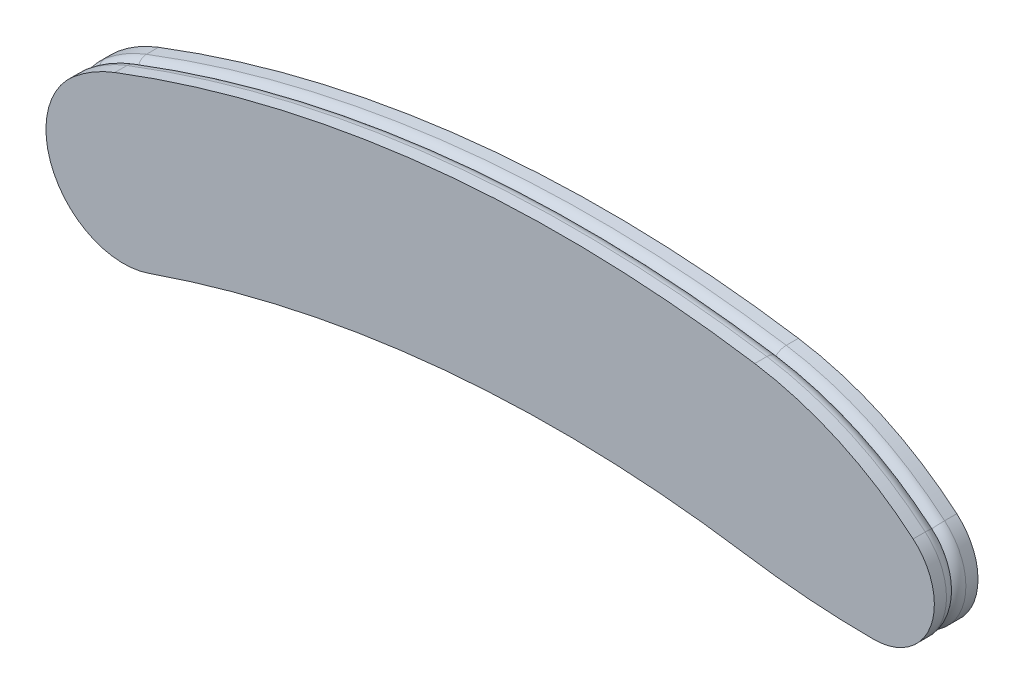
ISO-10303-21;
HEADER;
FILE_DESCRIPTION(('STEP AP214'),'2;1');
FILE_NAME('part.step','',(''),(''),'','','');
FILE_SCHEMA(('AUTOMOTIVE_DESIGN { 1 0 10303 214 1 1 1 1 }'));
ENDSEC;
DATA;
#1=APPLICATION_CONTEXT('core data for automotive mechanical design processes');
#2=APPLICATION_PROTOCOL_DEFINITION('international standard','automotive_design',2000,#1);
#3=PRODUCT_CONTEXT('',#1,'mechanical');
#4=PRODUCT('Part','Part','',(#3));
#5=PRODUCT_RELATED_PRODUCT_CATEGORY('part','',(#4));
#6=PRODUCT_DEFINITION_FORMATION('','',#4);
#7=PRODUCT_DEFINITION_CONTEXT('part definition',#1,'design');
#8=PRODUCT_DEFINITION('design','',#6,#7);
#9=PRODUCT_DEFINITION_SHAPE('','',#8);
#10=(LENGTH_UNIT() NAMED_UNIT(*) SI_UNIT(.MILLI.,.METRE.));
#11=(NAMED_UNIT(*) PLANE_ANGLE_UNIT() SI_UNIT($,.RADIAN.));
#12=(NAMED_UNIT(*) SI_UNIT($,.STERADIAN.) SOLID_ANGLE_UNIT());
#13=UNCERTAINTY_MEASURE_WITH_UNIT(LENGTH_MEASURE(1.E-05),#10,'distance_accuracy_value','');
#14=(GEOMETRIC_REPRESENTATION_CONTEXT(3) GLOBAL_UNCERTAINTY_ASSIGNED_CONTEXT((#13)) GLOBAL_UNIT_ASSIGNED_CONTEXT((#10,
#11,#12)) REPRESENTATION_CONTEXT('',''));
#15=CARTESIAN_POINT('',(0.,0.,0.));
#16=DIRECTION('',(0.,0.,1.));
#17=DIRECTION('',(1.,0.,0.));
#18=AXIS2_PLACEMENT_3D('',#15,#16,#17);
#19=CARTESIAN_POINT('',(-74.7215728623867,1.04234452640998,2.286));
#20=DIRECTION('',(0.,0.,-1.));
#21=DIRECTION('',(1.,0.,0.));
#22=AXIS2_PLACEMENT_3D('',#19,#20,#21);
#23=CYLINDRICAL_SURFACE('',#22,33.3863887810395);
#24=DIRECTION('',(0.,0.,-1.));
#25=VECTOR('',#24,1.);
#26=CARTESIAN_POINT('',(-69.6157277483273,34.036,2.286));
#27=LINE('',#26,#25);
#28=CARTESIAN_POINT('',(-69.6157277483273,34.036,2.286));
#29=VERTEX_POINT('',#28);
#30=CARTESIAN_POINT('',(-69.6157277483273,34.036,1.016));
#31=VERTEX_POINT('',#30);
#32=EDGE_CURVE('E157',#29,#31,#27,.T.);
#33=ORIENTED_EDGE('',*,*,#32,.F.);
#34=CARTESIAN_POINT('',(-74.7215728623867,1.04234452640998,2.286));
#35=DIRECTION('',(0.,0.,-1.));
#36=DIRECTION('',(-1.,0.,0.));
#37=AXIS2_PLACEMENT_3D('',#34,#35,#36);
#38=CIRCLE('',#37,33.3863887810395);
#39=CARTESIAN_POINT('',(-53.0229884904449,26.416,2.286));
#40=VERTEX_POINT('',#39);
#41=EDGE_CURVE('E136',#29,#40,#38,.T.);
#42=ORIENTED_EDGE('',*,*,#41,.T.);
#43=DIRECTION('',(0.,0.,-1.));
#44=VECTOR('',#43,1.);
#45=CARTESIAN_POINT('',(-53.0229884904449,26.416,2.286));
#46=LINE('',#45,#44);
#47=CARTESIAN_POINT('',(-53.0229884904449,26.416,1.016));
#48=VERTEX_POINT('',#47);
#49=EDGE_CURVE('E146',#40,#48,#46,.T.);
#50=ORIENTED_EDGE('',*,*,#49,.T.);
#51=CARTESIAN_POINT('',(-74.7215728623867,1.04234452640998,1.016));
#52=DIRECTION('',(0.,0.,-1.));
#53=DIRECTION('',(-1.,0.,0.));
#54=AXIS2_PLACEMENT_3D('',#51,#52,#53);
#55=CIRCLE('',#54,33.3863887810395);
#56=EDGE_CURVE('E209',#31,#48,#55,.T.);
#57=ORIENTED_EDGE('',*,*,#56,.F.);
#58=EDGE_LOOP('',(#33,#42,#50,#57));
#59=FACE_BOUND('',#58,.T.);
#60=ADVANCED_FACE('F48',(#59),#23,.T.);
#61=CARTESIAN_POINT('',(-57.15,21.59,2.286));
#62=DIRECTION('',(0.,0.,-1.));
#63=DIRECTION('',(1.,0.,0.));
#64=AXIS2_PLACEMENT_3D('',#61,#62,#63);
#65=CYLINDRICAL_SURFACE('',#64,6.35);
#66=ORIENTED_EDGE('',*,*,#49,.F.);
#67=CARTESIAN_POINT('',(-57.15,21.59,2.286));
#68=DIRECTION('',(0.,0.,-1.));
#69=DIRECTION('',(-1.,0.,0.));
#70=AXIS2_PLACEMENT_3D('',#67,#68,#69);
#71=CIRCLE('',#70,6.35);
#72=CARTESIAN_POINT('',(-57.15,15.24,2.286));
#73=VERTEX_POINT('',#72);
#74=EDGE_CURVE('E132',#40,#73,#71,.T.);
#75=ORIENTED_EDGE('',*,*,#74,.T.);
#76=DIRECTION('',(0.,0.,-1.));
#77=VECTOR('',#76,1.);
#78=CARTESIAN_POINT('',(-57.15,15.24,2.286));
#79=LINE('',#78,#77);
#80=CARTESIAN_POINT('',(-57.15,15.24,1.016));
#81=VERTEX_POINT('',#80);
#82=EDGE_CURVE('E154',#73,#81,#79,.T.);
#83=ORIENTED_EDGE('',*,*,#82,.T.);
#84=CARTESIAN_POINT('',(-57.15,21.59,1.016));
#85=DIRECTION('',(0.,0.,-1.));
#86=DIRECTION('',(-1.,0.,0.));
#87=AXIS2_PLACEMENT_3D('',#84,#85,#86);
#88=CIRCLE('',#87,6.35);
#89=EDGE_CURVE('E149',#48,#81,#88,.T.);
#90=ORIENTED_EDGE('',*,*,#89,.F.);
#91=EDGE_LOOP('',(#66,#75,#83,#90));
#92=FACE_BOUND('',#91,.T.);
#93=ADVANCED_FACE('F147',(#92),#65,.T.);
#94=CARTESIAN_POINT('',(-57.15,104.93375,2.286));
#95=DIRECTION('',(0.,0.,-1.));
#96=DIRECTION('',(1.,0.,0.));
#97=AXIS2_PLACEMENT_3D('',#94,#95,#96);
#98=CYLINDRICAL_SURFACE('',#97,89.6937500000003);
#99=ORIENTED_EDGE('',*,*,#82,.F.);
#100=CARTESIAN_POINT('',(-57.15,104.93375,2.286));
#101=DIRECTION('',(0.,0.,-1.));
#102=DIRECTION('',(-1.,0.,0.));
#103=AXIS2_PLACEMENT_3D('',#100,#101,#102);
#104=CIRCLE('',#103,89.6937500000003);
#105=CARTESIAN_POINT('',(-70.6119999999999,16.256,2.286));
#106=VERTEX_POINT('',#105);
#107=EDGE_CURVE('E139',#73,#106,#104,.T.);
#108=ORIENTED_EDGE('',*,*,#107,.T.);
#109=DIRECTION('',(0.,0.,-1.));
#110=VECTOR('',#109,1.);
#111=CARTESIAN_POINT('',(-70.6119999999999,16.256,2.286));
#112=LINE('',#111,#110);
#113=CARTESIAN_POINT('',(-70.6119999999999,16.256,1.016));
#114=VERTEX_POINT('',#113);
#115=EDGE_CURVE('E183',#106,#114,#112,.T.);
#116=ORIENTED_EDGE('',*,*,#115,.T.);
#117=CARTESIAN_POINT('',(-57.15,104.93375,1.016));
#118=DIRECTION('',(0.,0.,-1.));
#119=DIRECTION('',(-1.,0.,0.));
#120=AXIS2_PLACEMENT_3D('',#117,#118,#119);
#121=CIRCLE('',#120,89.6937500000003);
#122=EDGE_CURVE('E153',#81,#114,#121,.T.);
#123=ORIENTED_EDGE('',*,*,#122,.F.);
#124=EDGE_LOOP('',(#99,#108,#116,#123));
#125=FACE_BOUND('',#124,.T.);
#126=ADVANCED_FACE('F252',(#125),#98,.T.);
#127=CARTESIAN_POINT('',(-90.1893374241713,-112.705092985167,2.286));
#128=DIRECTION('',(0.,0.,-1.));
#129=DIRECTION('',(1.,0.,0.));
#130=AXIS2_PLACEMENT_3D('',#127,#128,#129);
#131=CYLINDRICAL_SURFACE('',#130,130.438627885105);
#132=ORIENTED_EDGE('',*,*,#115,.F.);
#133=CARTESIAN_POINT('',(-90.1893374241713,-112.705092985167,2.286));
#134=DIRECTION('',(0.,0.,1.));
#135=DIRECTION('',(-1.,0.,0.));
#136=AXIS2_PLACEMENT_3D('',#133,#134,#135);
#137=CIRCLE('',#136,130.438627885105);
#138=CARTESIAN_POINT('',(-133.070926792478,10.4834005432333,2.286));
#139=VERTEX_POINT('',#138);
#140=EDGE_CURVE('E162',#106,#139,#137,.T.);
#141=ORIENTED_EDGE('',*,*,#140,.T.);
#142=DIRECTION('',(0.,0.,-1.));
#143=VECTOR('',#142,1.);
#144=CARTESIAN_POINT('',(-133.070926792478,10.4834005432333,2.286));
#145=LINE('',#144,#143);
#146=CARTESIAN_POINT('',(-133.070926792478,10.4834005432333,1.016));
#147=VERTEX_POINT('',#146);
#148=EDGE_CURVE('E180',#139,#147,#145,.T.);
#149=ORIENTED_EDGE('',*,*,#148,.T.);
#150=CARTESIAN_POINT('',(-90.1893374241713,-112.705092985167,1.016));
#151=DIRECTION('',(0.,0.,-1.));
#152=DIRECTION('',(-1.,0.,0.));
#153=AXIS2_PLACEMENT_3D('',#150,#151,#152);
#154=CIRCLE('',#153,130.438627885105);
#155=EDGE_CURVE('E12',#114,#147,#154,.F.);
#156=ORIENTED_EDGE('',*,*,#155,.F.);
#157=EDGE_LOOP('',(#132,#141,#149,#156));
#158=FACE_BOUND('',#157,.T.);
#159=ADVANCED_FACE('F249',(#158),#131,.F.);
#160=CARTESIAN_POINT('',(-135.742999966174,18.159624156079,2.286));
#161=DIRECTION('',(0.,0.,-1.));
#162=DIRECTION('',(1.,0.,0.));
#163=AXIS2_PLACEMENT_3D('',#160,#161,#162);
#164=CYLINDRICAL_SURFACE('',#163,8.128);
#165=ORIENTED_EDGE('',*,*,#148,.F.);
#166=CARTESIAN_POINT('',(-135.742999966174,18.159624156079,2.286));
#167=DIRECTION('',(0.,0.,-1.));
#168=DIRECTION('',(-1.,0.,0.));
#169=AXIS2_PLACEMENT_3D('',#166,#167,#168);
#170=CIRCLE('',#169,8.128);
#171=CARTESIAN_POINT('',(-140.97,24.384,2.286));
#172=VERTEX_POINT('',#171);
#173=EDGE_CURVE('E165',#139,#172,#170,.T.);
#174=ORIENTED_EDGE('',*,*,#173,.T.);
#175=DIRECTION('',(0.,0.,-1.));
#176=VECTOR('',#175,1.);
#177=CARTESIAN_POINT('',(-140.97,24.384,2.286));
#178=LINE('',#177,#176);
#179=CARTESIAN_POINT('',(-140.97,24.384,1.016));
#180=VERTEX_POINT('',#179);
#181=EDGE_CURVE('E177',#172,#180,#178,.T.);
#182=ORIENTED_EDGE('',*,*,#181,.T.);
#183=CARTESIAN_POINT('',(-135.742999966174,18.159624156079,1.016));
#184=DIRECTION('',(0.,0.,-1.));
#185=DIRECTION('',(-1.,0.,0.));
#186=AXIS2_PLACEMENT_3D('',#183,#184,#185);
#187=CIRCLE('',#186,8.128);
#188=EDGE_CURVE('E57',#147,#180,#187,.T.);
#189=ORIENTED_EDGE('',*,*,#188,.F.);
#190=EDGE_LOOP('',(#165,#174,#182,#189));
#191=FACE_BOUND('',#190,.T.);
#192=ADVANCED_FACE('F245',(#191),#164,.T.);
#193=CARTESIAN_POINT('',(-131.267684261023,12.8303632437396,2.286));
#194=DIRECTION('',(0.,0.,-1.));
#195=DIRECTION('',(1.,0.,0.));
#196=AXIS2_PLACEMENT_3D('',#193,#194,#195);
#197=CYLINDRICAL_SURFACE('',#196,15.0871287193557);
#198=ORIENTED_EDGE('',*,*,#181,.F.);
#199=CARTESIAN_POINT('',(-131.267684261023,12.8303632437396,2.286));
#200=DIRECTION('',(0.,0.,-1.));
#201=DIRECTION('',(-1.,0.,0.));
#202=AXIS2_PLACEMENT_3D('',#199,#200,#201);
#203=CIRCLE('',#202,15.0871287193557);
#204=CARTESIAN_POINT('',(-136.652,26.924,2.286));
#205=VERTEX_POINT('',#204);
#206=EDGE_CURVE('E168',#172,#205,#203,.T.);
#207=ORIENTED_EDGE('',*,*,#206,.T.);
#208=DIRECTION('',(0.,0.,-1.));
#209=VECTOR('',#208,1.);
#210=CARTESIAN_POINT('',(-136.652,26.924,2.286));
#211=LINE('',#210,#209);
#212=CARTESIAN_POINT('',(-136.652,26.924,1.016));
#213=VERTEX_POINT('',#212);
#214=EDGE_CURVE('E174',#205,#213,#211,.T.);
#215=ORIENTED_EDGE('',*,*,#214,.T.);
#216=CARTESIAN_POINT('',(-131.267684261023,12.8303632437396,1.016));
#217=DIRECTION('',(0.,0.,-1.));
#218=DIRECTION('',(-1.,0.,0.));
#219=AXIS2_PLACEMENT_3D('',#216,#217,#218);
#220=CIRCLE('',#219,15.0871287193557);
#221=EDGE_CURVE('E214',#180,#213,#220,.T.);
#222=ORIENTED_EDGE('',*,*,#221,.F.);
#223=EDGE_LOOP('',(#198,#207,#215,#222));
#224=FACE_BOUND('',#223,.T.);
#225=ADVANCED_FACE('F243',(#224),#197,.T.);
#226=CARTESIAN_POINT('',(-89.7250228038504,-95.909021452324,2.286));
#227=DIRECTION('',(0.,0.,-1.));
#228=DIRECTION('',(1.,0.,0.));
#229=AXIS2_PLACEMENT_3D('',#226,#227,#228);
#230=CYLINDRICAL_SURFACE('',#229,131.491795743594);
#231=ORIENTED_EDGE('',*,*,#214,.F.);
#232=CARTESIAN_POINT('',(-89.7250228038504,-95.909021452324,2.286));
#233=DIRECTION('',(0.,0.,-1.));
#234=DIRECTION('',(-1.,0.,0.));
#235=AXIS2_PLACEMENT_3D('',#232,#233,#234);
#236=CIRCLE('',#235,131.491795743594);
#237=EDGE_CURVE('E171',#205,#29,#236,.T.);
#238=ORIENTED_EDGE('',*,*,#237,.T.);
#239=ORIENTED_EDGE('',*,*,#32,.T.);
#240=CARTESIAN_POINT('',(-89.7250228038504,-95.909021452324,1.016));
#241=DIRECTION('',(0.,0.,-1.));
#242=DIRECTION('',(-1.,0.,0.));
#243=AXIS2_PLACEMENT_3D('',#240,#241,#242);
#244=CIRCLE('',#243,131.491795743594);
#245=EDGE_CURVE('E211',#213,#31,#244,.T.);
#246=ORIENTED_EDGE('',*,*,#245,.F.);
#247=EDGE_LOOP('',(#231,#238,#239,#246));
#248=FACE_BOUND('',#247,.T.);
#249=ADVANCED_FACE('F239',(#248),#230,.T.);
#250=CARTESIAN_POINT('',(-65.9357864311934,11.316172263205,2.286));
#251=DIRECTION('',(0.,0.,1.));
#252=DIRECTION('',(-1.,0.,0.));
#253=AXIS2_PLACEMENT_3D('',#250,#251,#252);
#254=PLANE('',#253);
#255=ORIENTED_EDGE('',*,*,#41,.F.);
#256=ORIENTED_EDGE('',*,*,#237,.F.);
#257=ORIENTED_EDGE('',*,*,#206,.F.);
#258=ORIENTED_EDGE('',*,*,#173,.F.);
#259=ORIENTED_EDGE('',*,*,#140,.F.);
#260=ORIENTED_EDGE('',*,*,#107,.F.);
#261=ORIENTED_EDGE('',*,*,#74,.F.);
#262=EDGE_LOOP('',(#255,#256,#257,#258,#259,#260,#261));
#263=FACE_BOUND('',#262,.T.);
#264=ADVANCED_FACE('F134',(#263),#254,.T.);
#265=CARTESIAN_POINT('',(-65.9357864311934,11.316172263205,-0.254));
#266=DIRECTION('',(0.,0.,1.));
#267=DIRECTION('',(-1.,0.,0.));
#268=AXIS2_PLACEMENT_3D('',#265,#266,#267);
#269=PLANE('',#268);
#270=CARTESIAN_POINT('',(-90.1893374241713,-112.705092985167,-0.254));
#271=DIRECTION('',(0.,0.,-1.));
#272=DIRECTION('',(-1.,0.,0.));
#273=AXIS2_PLACEMENT_3D('',#270,#271,#272);
#274=CIRCLE('',#273,131.708627885105);
#275=CARTESIAN_POINT('',(-133.488438225868,11.6828104827404,-0.254));
#276=VERTEX_POINT('',#275);
#277=CARTESIAN_POINT('',(-70.4213876106194,17.511614159292,-0.254));
#278=VERTEX_POINT('',#277);
#279=EDGE_CURVE('E189',#276,#278,#274,.T.);
#280=ORIENTED_EDGE('',*,*,#279,.F.);
#281=CARTESIAN_POINT('',(-135.742999966174,18.159624156079,-0.254));
#282=DIRECTION('',(0.,0.,-1.));
#283=DIRECTION('',(-1.,0.,0.));
#284=AXIS2_PLACEMENT_3D('',#281,#282,#283);
#285=CIRCLE('',#284,6.858);
#286=CARTESIAN_POINT('',(-140.153281244715,23.4114412743873,-0.254));
#287=VERTEX_POINT('',#286);
#288=EDGE_CURVE('E192',#287,#276,#285,.F.);
#289=ORIENTED_EDGE('',*,*,#288,.F.);
#290=CARTESIAN_POINT('',(-131.267684261023,12.8303632437396,-0.254));
#291=DIRECTION('',(0.,0.,-1.));
#292=DIRECTION('',(-1.,0.,0.));
#293=AXIS2_PLACEMENT_3D('',#290,#291,#292);
#294=CIRCLE('',#293,13.8171287193557);
#295=CARTESIAN_POINT('',(-136.19876061193,25.7376298819081,-0.254));
#296=VERTEX_POINT('',#295);
#297=EDGE_CURVE('E194',#296,#287,#294,.F.);
#298=ORIENTED_EDGE('',*,*,#297,.F.);
#299=CARTESIAN_POINT('',(-89.7250228038504,-95.909021452324,-0.254));
#300=DIRECTION('',(0.,0.,-1.));
#301=DIRECTION('',(-1.,0.,0.));
#302=AXIS2_PLACEMENT_3D('',#299,#300,#301);
#303=CIRCLE('',#302,130.221795743594);
#304=CARTESIAN_POINT('',(-69.8099513086346,32.7809393605799,-0.254));
#305=VERTEX_POINT('',#304);
#306=EDGE_CURVE('E196',#305,#296,#303,.F.);
#307=ORIENTED_EDGE('',*,*,#306,.F.);
#308=CARTESIAN_POINT('',(-74.7215728623867,1.04234452640998,-0.254));
#309=DIRECTION('',(0.,0.,-1.));
#310=DIRECTION('',(-1.,0.,0.));
#311=AXIS2_PLACEMENT_3D('',#308,#309,#310);
#312=CIRCLE('',#311,32.1163887810395);
#313=CARTESIAN_POINT('',(-53.8483907923559,25.4508,-0.254));
#314=VERTEX_POINT('',#313);
#315=EDGE_CURVE('E199',#314,#305,#312,.F.);
#316=ORIENTED_EDGE('',*,*,#315,.F.);
#317=CARTESIAN_POINT('',(-57.15,21.59,-0.254));
#318=DIRECTION('',(0.,0.,-1.));
#319=DIRECTION('',(-1.,0.,0.));
#320=AXIS2_PLACEMENT_3D('',#317,#318,#319);
#321=CIRCLE('',#320,5.08);
#322=CARTESIAN_POINT('',(-57.15,16.51,-0.254));
#323=VERTEX_POINT('',#322);
#324=EDGE_CURVE('E202',#323,#314,#321,.F.);
#325=ORIENTED_EDGE('',*,*,#324,.F.);
#326=CARTESIAN_POINT('',(-57.15,104.93375,-0.254));
#327=DIRECTION('',(0.,0.,-1.));
#328=DIRECTION('',(-1.,0.,0.));
#329=AXIS2_PLACEMENT_3D('',#326,#327,#328);
#330=CIRCLE('',#329,88.4237500000003);
#331=EDGE_CURVE('E205',#278,#323,#330,.F.);
#332=ORIENTED_EDGE('',*,*,#331,.F.);
#333=EDGE_LOOP('',(#280,#289,#298,#307,#316,#325,#332));
#334=FACE_BOUND('',#333,.T.);
#335=ADVANCED_FACE('F234',(#334),#269,.F.);
#336=CARTESIAN_POINT('',(-89.7250228038504,-95.909021452324,1.016));
#337=DIRECTION('',(0.,0.,1.));
#338=DIRECTION('',(-1.,0.,0.));
#339=AXIS2_PLACEMENT_3D('',#336,#337,#338);
#340=TOROIDAL_SURFACE('',#339,130.221795743594,1.27);
#341=CARTESIAN_POINT('',(-69.8099513086346,32.7809393605799,1.016));
#342=DIRECTION('',(-0.98823672395283,0.152931937249805,0.));
#343=DIRECTION('',(0.152931937249805,0.98823672395283,0.));
#344=AXIS2_PLACEMENT_3D('',#341,#342,#343);
#345=CIRCLE('',#344,1.27);
#346=EDGE_CURVE('E159',#31,#305,#345,.T.);
#347=ORIENTED_EDGE('',*,*,#346,.T.);
#348=ORIENTED_EDGE('',*,*,#306,.T.);
#349=CARTESIAN_POINT('',(-136.19876061193,25.7376298819081,1.016));
#350=DIRECTION('',(0.934149699285011,0.356881407929475,0.));
#351=DIRECTION('',(0.356881407929475,-0.934149699285011,0.));
#352=AXIS2_PLACEMENT_3D('',#349,#350,#351);
#353=CIRCLE('',#352,1.27);
#354=EDGE_CURVE('E52',#296,#213,#353,.T.);
#355=ORIENTED_EDGE('',*,*,#354,.T.);
#356=ORIENTED_EDGE('',*,*,#245,.T.);
#357=EDGE_LOOP('',(#347,#348,#355,#356));
#358=FACE_BOUND('',#357,.T.);
#359=ADVANCED_FACE('F50',(#358),#340,.T.);
#360=CARTESIAN_POINT('',(-131.267684261023,12.8303632437396,1.016));
#361=DIRECTION('',(0.,0.,1.));
#362=DIRECTION('',(-1.,0.,0.));
#363=AXIS2_PLACEMENT_3D('',#360,#361,#362);
#364=TOROIDAL_SURFACE('',#363,13.8171287193557,1.27);
#365=ORIENTED_EDGE('',*,*,#354,.F.);
#366=ORIENTED_EDGE('',*,*,#297,.T.);
#367=CARTESIAN_POINT('',(-140.153281244715,23.4114412743873,1.016));
#368=DIRECTION('',(0.765794272135951,0.643085634082872,0.));
#369=DIRECTION('',(0.643085634082872,-0.765794272135951,0.));
#370=AXIS2_PLACEMENT_3D('',#367,#368,#369);
#371=CIRCLE('',#370,1.27);
#372=EDGE_CURVE('E73',#287,#180,#371,.T.);
#373=ORIENTED_EDGE('',*,*,#372,.T.);
#374=ORIENTED_EDGE('',*,*,#221,.T.);
#375=EDGE_LOOP('',(#365,#366,#373,#374));
#376=FACE_BOUND('',#375,.T.);
#377=ADVANCED_FACE('F236',(#376),#364,.T.);
#378=CARTESIAN_POINT('',(-74.7215728623867,1.04234452640998,1.016));
#379=DIRECTION('',(0.,0.,1.));
#380=DIRECTION('',(-1.,0.,0.));
#381=AXIS2_PLACEMENT_3D('',#378,#379,#380);
#382=TOROIDAL_SURFACE('',#381,32.1163887810395,1.27);
#383=ORIENTED_EDGE('',*,*,#346,.F.);
#384=ORIENTED_EDGE('',*,*,#56,.T.);
#385=CARTESIAN_POINT('',(-53.8483907923559,25.4508,1.016));
#386=DIRECTION('',(-0.76,0.649923072370877,0.));
#387=DIRECTION('',(0.649923072370877,0.76,0.));
#388=AXIS2_PLACEMENT_3D('',#385,#386,#387);
#389=CIRCLE('',#388,1.27);
#390=EDGE_CURVE('E222',#48,#314,#389,.T.);
#391=ORIENTED_EDGE('',*,*,#390,.T.);
#392=ORIENTED_EDGE('',*,*,#315,.T.);
#393=EDGE_LOOP('',(#383,#384,#391,#392));
#394=FACE_BOUND('',#393,.T.);
#395=ADVANCED_FACE('F230',(#394),#382,.T.);
#396=CARTESIAN_POINT('',(-135.742999966174,18.159624156079,1.016));
#397=DIRECTION('',(0.,0.,1.));
#398=DIRECTION('',(-1.,0.,0.));
#399=AXIS2_PLACEMENT_3D('',#396,#397,#398);
#400=TOROIDAL_SURFACE('',#399,6.858,1.27);
#401=ORIENTED_EDGE('',*,*,#372,.F.);
#402=ORIENTED_EDGE('',*,*,#288,.T.);
#403=CARTESIAN_POINT('',(-133.488438225868,11.6828104827404,1.016));
#404=DIRECTION('',(-0.944417275202477,-0.328749160149694,0.));
#405=DIRECTION('',(-0.328749160149694,0.944417275202477,0.));
#406=AXIS2_PLACEMENT_3D('',#403,#404,#405);
#407=CIRCLE('',#406,1.27);
#408=EDGE_CURVE('E65',#276,#147,#407,.T.);
#409=ORIENTED_EDGE('',*,*,#408,.T.);
#410=ORIENTED_EDGE('',*,*,#188,.T.);
#411=EDGE_LOOP('',(#401,#402,#409,#410));
#412=FACE_BOUND('',#411,.T.);
#413=ADVANCED_FACE('F259',(#412),#400,.T.);
#414=CARTESIAN_POINT('',(-57.15,21.59,1.016));
#415=DIRECTION('',(0.,0.,1.));
#416=DIRECTION('',(-1.,0.,0.));
#417=AXIS2_PLACEMENT_3D('',#414,#415,#416);
#418=TOROIDAL_SURFACE('',#417,5.08,1.27);
#419=ORIENTED_EDGE('',*,*,#390,.F.);
#420=ORIENTED_EDGE('',*,*,#89,.T.);
#421=CARTESIAN_POINT('',(-57.15,16.51,1.016));
#422=DIRECTION('',(1.,0.,0.));
#423=DIRECTION('',(0.,-1.,0.));
#424=AXIS2_PLACEMENT_3D('',#421,#422,#423);
#425=CIRCLE('',#424,1.27);
#426=EDGE_CURVE('E219',#81,#323,#425,.T.);
#427=ORIENTED_EDGE('',*,*,#426,.T.);
#428=ORIENTED_EDGE('',*,*,#324,.T.);
#429=EDGE_LOOP('',(#419,#420,#427,#428));
#430=FACE_BOUND('',#429,.T.);
#431=ADVANCED_FACE('F255',(#430),#418,.T.);
#432=CARTESIAN_POINT('',(-90.1893374241713,-112.705092985167,1.016));
#433=DIRECTION('',(0.,0.,1.));
#434=DIRECTION('',(-1.,0.,0.));
#435=AXIS2_PLACEMENT_3D('',#432,#433,#434);
#436=TOROIDAL_SURFACE('',#435,131.708627885105,1.27);
#437=ORIENTED_EDGE('',*,*,#408,.F.);
#438=ORIENTED_EDGE('',*,*,#279,.T.);
#439=CARTESIAN_POINT('',(-70.4213876106194,17.511614159292,1.016));
#440=DIRECTION('',(-0.988672566371681,0.150088495575222,0.));
#441=DIRECTION('',(0.150088495575222,0.988672566371681,0.));
#442=AXIS2_PLACEMENT_3D('',#439,#440,#441);
#443=CIRCLE('',#442,1.27);
#444=EDGE_CURVE('E217',#278,#114,#443,.T.);
#445=ORIENTED_EDGE('',*,*,#444,.T.);
#446=ORIENTED_EDGE('',*,*,#155,.T.);
#447=EDGE_LOOP('',(#437,#438,#445,#446));
#448=FACE_BOUND('',#447,.T.);
#449=ADVANCED_FACE('F258',(#448),#436,.T.);
#450=CARTESIAN_POINT('',(-57.15,104.93375,1.016));
#451=DIRECTION('',(0.,0.,1.));
#452=DIRECTION('',(-1.,0.,0.));
#453=AXIS2_PLACEMENT_3D('',#450,#451,#452);
#454=TOROIDAL_SURFACE('',#453,88.4237500000003,1.27);
#455=ORIENTED_EDGE('',*,*,#426,.F.);
#456=ORIENTED_EDGE('',*,*,#122,.T.);
#457=ORIENTED_EDGE('',*,*,#444,.F.);
#458=ORIENTED_EDGE('',*,*,#331,.T.);
#459=EDGE_LOOP('',(#455,#456,#457,#458));
#460=FACE_BOUND('',#459,.T.);
#461=ADVANCED_FACE('F276',(#460),#454,.T.);
#462=CLOSED_SHELL('',(#60,#93,#126,#159,#192,#225,#249,#264,#335,#359,#377,#395,#413,#431,#449,#461));
#463=MANIFOLD_SOLID_BREP('B2',#462);
#464=CARTESIAN_POINT('',(-74.7215728623867,1.04234452640998,-2.286));
#465=DIRECTION('',(0.,0.,1.));
#466=DIRECTION('',(1.,0.,0.));
#467=AXIS2_PLACEMENT_3D('',#464,#465,#466);
#468=CYLINDRICAL_SURFACE('',#467,33.3863887810395);
#469=DIRECTION('',(0.,0.,1.));
#470=VECTOR('',#469,1.);
#471=CARTESIAN_POINT('',(-69.6157277483273,34.036,-2.286));
#472=LINE('',#471,#470);
#473=CARTESIAN_POINT('',(-69.6157277483273,34.036,-2.286));
#474=VERTEX_POINT('',#473);
#475=CARTESIAN_POINT('',(-69.6157277483273,34.036,-1.016));
#476=VERTEX_POINT('',#475);
#477=EDGE_CURVE('E555',#474,#476,#472,.T.);
#478=ORIENTED_EDGE('',*,*,#477,.T.);
#479=CARTESIAN_POINT('',(-74.7215728623867,1.04234452640998,-1.016));
#480=DIRECTION('',(0.,0.,-1.));
#481=DIRECTION('',(-1.,0.,0.));
#482=AXIS2_PLACEMENT_3D('',#479,#480,#481);
#483=CIRCLE('',#482,33.3863887810395);
#484=CARTESIAN_POINT('',(-53.0229884904449,26.416,-1.016));
#485=VERTEX_POINT('',#484);
#486=EDGE_CURVE('E493',#476,#485,#483,.T.);
#487=ORIENTED_EDGE('',*,*,#486,.T.);
#488=DIRECTION('',(0.,0.,1.));
#489=VECTOR('',#488,1.);
#490=CARTESIAN_POINT('',(-53.0229884904449,26.416,-2.286));
#491=LINE('',#490,#489);
#492=CARTESIAN_POINT('',(-53.0229884904449,26.416,-2.286));
#493=VERTEX_POINT('',#492);
#494=EDGE_CURVE('E475',#493,#485,#491,.T.);
#495=ORIENTED_EDGE('',*,*,#494,.F.);
#496=CARTESIAN_POINT('',(-74.7215728623867,1.04234452640998,-2.286));
#497=DIRECTION('',(0.,0.,-1.));
#498=DIRECTION('',(-1.,0.,0.));
#499=AXIS2_PLACEMENT_3D('',#496,#497,#498);
#500=CIRCLE('',#499,33.3863887810395);
#501=EDGE_CURVE('E482',#474,#493,#500,.T.);
#502=ORIENTED_EDGE('',*,*,#501,.F.);
#503=EDGE_LOOP('',(#478,#487,#495,#502));
#504=FACE_BOUND('',#503,.T.);
#505=ADVANCED_FACE('F389',(#504),#468,.T.);
#506=CARTESIAN_POINT('',(-57.15,21.59,-2.286));
#507=DIRECTION('',(0.,0.,1.));
#508=DIRECTION('',(1.,0.,0.));
#509=AXIS2_PLACEMENT_3D('',#506,#507,#508);
#510=CYLINDRICAL_SURFACE('',#509,6.35);
#511=ORIENTED_EDGE('',*,*,#494,.T.);
#512=CARTESIAN_POINT('',(-57.15,21.59,-1.016));
#513=DIRECTION('',(0.,0.,-1.));
#514=DIRECTION('',(-1.,0.,0.));
#515=AXIS2_PLACEMENT_3D('',#512,#513,#514);
#516=CIRCLE('',#515,6.35);
#517=CARTESIAN_POINT('',(-57.15,15.24,-1.016));
#518=VERTEX_POINT('',#517);
#519=EDGE_CURVE('E517',#485,#518,#516,.T.);
#520=ORIENTED_EDGE('',*,*,#519,.T.);
#521=DIRECTION('',(0.,0.,1.));
#522=VECTOR('',#521,1.);
#523=CARTESIAN_POINT('',(-57.15,15.24,-2.286));
#524=LINE('',#523,#522);
#525=CARTESIAN_POINT('',(-57.15,15.24,-2.286));
#526=VERTEX_POINT('',#525);
#527=EDGE_CURVE('E478',#526,#518,#524,.T.);
#528=ORIENTED_EDGE('',*,*,#527,.F.);
#529=CARTESIAN_POINT('',(-57.15,21.59,-2.286));
#530=DIRECTION('',(0.,0.,-1.));
#531=DIRECTION('',(-1.,0.,0.));
#532=AXIS2_PLACEMENT_3D('',#529,#530,#531);
#533=CIRCLE('',#532,6.35);
#534=EDGE_CURVE('E471',#493,#526,#533,.T.);
#535=ORIENTED_EDGE('',*,*,#534,.F.);
#536=EDGE_LOOP('',(#511,#520,#528,#535));
#537=FACE_BOUND('',#536,.T.);
#538=ADVANCED_FACE('F473',(#537),#510,.T.);
#539=CARTESIAN_POINT('',(-57.15,104.93375,-2.286));
#540=DIRECTION('',(0.,0.,1.));
#541=DIRECTION('',(1.,0.,0.));
#542=AXIS2_PLACEMENT_3D('',#539,#540,#541);
#543=CYLINDRICAL_SURFACE('',#542,89.6937500000003);
#544=ORIENTED_EDGE('',*,*,#527,.T.);
#545=CARTESIAN_POINT('',(-57.15,104.93375,-1.016));
#546=DIRECTION('',(0.,0.,-1.));
#547=DIRECTION('',(-1.,0.,0.));
#548=AXIS2_PLACEMENT_3D('',#545,#546,#547);
#549=CIRCLE('',#548,89.6937500000003);
#550=CARTESIAN_POINT('',(-70.6119999999999,16.256,-1.016));
#551=VERTEX_POINT('',#550);
#552=EDGE_CURVE('E494',#518,#551,#549,.T.);
#553=ORIENTED_EDGE('',*,*,#552,.T.);
#554=DIRECTION('',(0.,0.,1.));
#555=VECTOR('',#554,1.);
#556=CARTESIAN_POINT('',(-70.6119999999999,16.256,-2.286));
#557=LINE('',#556,#555);
#558=CARTESIAN_POINT('',(-70.6119999999999,16.256,-2.286));
#559=VERTEX_POINT('',#558);
#560=EDGE_CURVE('E499',#559,#551,#557,.T.);
#561=ORIENTED_EDGE('',*,*,#560,.F.);
#562=CARTESIAN_POINT('',(-57.15,104.93375,-2.286));
#563=DIRECTION('',(0.,0.,-1.));
#564=DIRECTION('',(-1.,0.,0.));
#565=AXIS2_PLACEMENT_3D('',#562,#563,#564);
#566=CIRCLE('',#565,89.6937500000003);
#567=EDGE_CURVE('E481',#526,#559,#566,.T.);
#568=ORIENTED_EDGE('',*,*,#567,.F.);
#569=EDGE_LOOP('',(#544,#553,#561,#568));
#570=FACE_BOUND('',#569,.T.);
#571=ADVANCED_FACE('F572',(#570),#543,.T.);
#572=CARTESIAN_POINT('',(-90.1893374241713,-112.705092985167,-2.286));
#573=DIRECTION('',(0.,0.,1.));
#574=DIRECTION('',(1.,0.,0.));
#575=AXIS2_PLACEMENT_3D('',#572,#573,#574);
#576=CYLINDRICAL_SURFACE('',#575,130.438627885105);
#577=ORIENTED_EDGE('',*,*,#560,.T.);
#578=CARTESIAN_POINT('',(-90.1893374241713,-112.705092985167,-1.016));
#579=DIRECTION('',(0.,0.,-1.));
#580=DIRECTION('',(-1.,0.,0.));
#581=AXIS2_PLACEMENT_3D('',#578,#579,#580);
#582=CIRCLE('',#581,130.438627885105);
#583=CARTESIAN_POINT('',(-133.070926792478,10.4834005432333,-1.016));
#584=VERTEX_POINT('',#583);
#585=EDGE_CURVE('E46',#551,#584,#582,.F.);
#586=ORIENTED_EDGE('',*,*,#585,.T.);
#587=DIRECTION('',(0.,0.,1.));
#588=VECTOR('',#587,1.);
#589=CARTESIAN_POINT('',(-133.070926792478,10.4834005432333,-2.286));
#590=LINE('',#589,#588);
#591=CARTESIAN_POINT('',(-133.070926792478,10.4834005432333,-2.286));
#592=VERTEX_POINT('',#591);
#593=EDGE_CURVE('E566',#592,#584,#590,.T.);
#594=ORIENTED_EDGE('',*,*,#593,.F.);
#595=CARTESIAN_POINT('',(-90.1893374241713,-112.705092985167,-2.286));
#596=DIRECTION('',(0.,0.,1.));
#597=DIRECTION('',(-1.,0.,0.));
#598=AXIS2_PLACEMENT_3D('',#595,#596,#597);
#599=CIRCLE('',#598,130.438627885105);
#600=EDGE_CURVE('E570',#559,#592,#599,.T.);
#601=ORIENTED_EDGE('',*,*,#600,.F.);
#602=EDGE_LOOP('',(#577,#586,#594,#601));
#603=FACE_BOUND('',#602,.T.);
#604=ADVANCED_FACE('F569',(#603),#576,.F.);
#605=CARTESIAN_POINT('',(-135.742999966174,18.159624156079,-2.286));
#606=DIRECTION('',(0.,0.,1.));
#607=DIRECTION('',(1.,0.,0.));
#608=AXIS2_PLACEMENT_3D('',#605,#606,#607);
#609=CYLINDRICAL_SURFACE('',#608,8.128);
#610=ORIENTED_EDGE('',*,*,#593,.T.);
#611=CARTESIAN_POINT('',(-135.742999966174,18.159624156079,-1.016));
#612=DIRECTION('',(0.,0.,-1.));
#613=DIRECTION('',(-1.,0.,0.));
#614=AXIS2_PLACEMENT_3D('',#611,#612,#613);
#615=CIRCLE('',#614,8.128);
#616=CARTESIAN_POINT('',(-140.97,24.384,-1.016));
#617=VERTEX_POINT('',#616);
#618=EDGE_CURVE('E398',#584,#617,#615,.T.);
#619=ORIENTED_EDGE('',*,*,#618,.T.);
#620=DIRECTION('',(0.,0.,1.));
#621=VECTOR('',#620,1.);
#622=CARTESIAN_POINT('',(-140.97,24.384,-2.286));
#623=LINE('',#622,#621);
#624=CARTESIAN_POINT('',(-140.97,24.384,-2.286));
#625=VERTEX_POINT('',#624);
#626=EDGE_CURVE('E559',#625,#617,#623,.T.);
#627=ORIENTED_EDGE('',*,*,#626,.F.);
#628=CARTESIAN_POINT('',(-135.742999966174,18.159624156079,-2.286));
#629=DIRECTION('',(0.,0.,-1.));
#630=DIRECTION('',(-1.,0.,0.));
#631=AXIS2_PLACEMENT_3D('',#628,#629,#630);
#632=CIRCLE('',#631,8.128);
#633=EDGE_CURVE('E723',#592,#625,#632,.T.);
#634=ORIENTED_EDGE('',*,*,#633,.F.);
#635=EDGE_LOOP('',(#610,#619,#627,#634));
#636=FACE_BOUND('',#635,.T.);
#637=ADVANCED_FACE('F685',(#636),#609,.T.);
#638=CARTESIAN_POINT('',(-131.267684261023,12.8303632437396,-2.286));
#639=DIRECTION('',(0.,0.,1.));
#640=DIRECTION('',(1.,0.,0.));
#641=AXIS2_PLACEMENT_3D('',#638,#639,#640);
#642=CYLINDRICAL_SURFACE('',#641,15.0871287193557);
#643=ORIENTED_EDGE('',*,*,#626,.T.);
#644=CARTESIAN_POINT('',(-131.267684261023,12.8303632437396,-1.016));
#645=DIRECTION('',(0.,0.,-1.));
#646=DIRECTION('',(-1.,0.,0.));
#647=AXIS2_PLACEMENT_3D('',#644,#645,#646);
#648=CIRCLE('',#647,15.0871287193557);
#649=CARTESIAN_POINT('',(-136.652,26.924,-1.016));
#650=VERTEX_POINT('',#649);
#651=EDGE_CURVE('E522',#617,#650,#648,.T.);
#652=ORIENTED_EDGE('',*,*,#651,.T.);
#653=DIRECTION('',(0.,0.,1.));
#654=VECTOR('',#653,1.);
#655=CARTESIAN_POINT('',(-136.652,26.924,-2.286));
#656=LINE('',#655,#654);
#657=CARTESIAN_POINT('',(-136.652,26.924,-2.286));
#658=VERTEX_POINT('',#657);
#659=EDGE_CURVE('E557',#658,#650,#656,.T.);
#660=ORIENTED_EDGE('',*,*,#659,.F.);
#661=CARTESIAN_POINT('',(-131.267684261023,12.8303632437396,-2.286));
#662=DIRECTION('',(0.,0.,-1.));
#663=DIRECTION('',(-1.,0.,0.));
#664=AXIS2_PLACEMENT_3D('',#661,#662,#663);
#665=CIRCLE('',#664,15.0871287193557);
#666=EDGE_CURVE('E561',#625,#658,#665,.T.);
#667=ORIENTED_EDGE('',*,*,#666,.F.);
#668=EDGE_LOOP('',(#643,#652,#660,#667));
#669=FACE_BOUND('',#668,.T.);
#670=ADVANCED_FACE('F676',(#669),#642,.T.);
#671=CARTESIAN_POINT('',(-89.7250228038504,-95.909021452324,-2.286));
#672=DIRECTION('',(0.,0.,1.));
#673=DIRECTION('',(1.,0.,0.));
#674=AXIS2_PLACEMENT_3D('',#671,#672,#673);
#675=CYLINDRICAL_SURFACE('',#674,131.491795743594);
#676=ORIENTED_EDGE('',*,*,#659,.T.);
#677=CARTESIAN_POINT('',(-89.7250228038504,-95.909021452324,-1.016));
#678=DIRECTION('',(0.,0.,-1.));
#679=DIRECTION('',(-1.,0.,0.));
#680=AXIS2_PLACEMENT_3D('',#677,#678,#679);
#681=CIRCLE('',#680,131.491795743594);
#682=EDGE_CURVE('E520',#650,#476,#681,.T.);
#683=ORIENTED_EDGE('',*,*,#682,.T.);
#684=ORIENTED_EDGE('',*,*,#477,.F.);
#685=CARTESIAN_POINT('',(-89.7250228038504,-95.909021452324,-2.286));
#686=DIRECTION('',(0.,0.,-1.));
#687=DIRECTION('',(-1.,0.,0.));
#688=AXIS2_PLACEMENT_3D('',#685,#686,#687);
#689=CIRCLE('',#688,131.491795743594);
#690=EDGE_CURVE('E487',#658,#474,#689,.T.);
#691=ORIENTED_EDGE('',*,*,#690,.F.);
#692=EDGE_LOOP('',(#676,#683,#684,#691));
#693=FACE_BOUND('',#692,.T.);
#694=ADVANCED_FACE('F554',(#693),#675,.T.);
#695=CARTESIAN_POINT('',(-65.9357864311934,11.316172263205,-2.286));
#696=DIRECTION('',(0.,0.,-1.));
#697=DIRECTION('',(-1.,0.,0.));
#698=AXIS2_PLACEMENT_3D('',#695,#696,#697);
#699=PLANE('',#698);
#700=ORIENTED_EDGE('',*,*,#501,.T.);
#701=ORIENTED_EDGE('',*,*,#534,.T.);
#702=ORIENTED_EDGE('',*,*,#567,.T.);
#703=ORIENTED_EDGE('',*,*,#600,.T.);
#704=ORIENTED_EDGE('',*,*,#633,.T.);
#705=ORIENTED_EDGE('',*,*,#666,.T.);
#706=ORIENTED_EDGE('',*,*,#690,.T.);
#707=EDGE_LOOP('',(#700,#701,#702,#703,#704,#705,#706));
#708=FACE_BOUND('',#707,.T.);
#709=ADVANCED_FACE('F485',(#708),#699,.T.);
#710=CARTESIAN_POINT('',(-65.9357864311934,11.316172263205,0.254));
#711=DIRECTION('',(0.,0.,-1.));
#712=DIRECTION('',(-1.,0.,0.));
#713=AXIS2_PLACEMENT_3D('',#710,#711,#712);
#714=PLANE('',#713);
#715=CARTESIAN_POINT('',(-90.1893374241713,-112.705092985167,0.254));
#716=DIRECTION('',(0.,0.,-1.));
#717=DIRECTION('',(-1.,0.,0.));
#718=AXIS2_PLACEMENT_3D('',#715,#716,#717);
#719=CIRCLE('',#718,131.708627885105);
#720=CARTESIAN_POINT('',(-133.488438225868,11.6828104827404,0.254));
#721=VERTEX_POINT('',#720);
#722=CARTESIAN_POINT('',(-70.4213876106194,17.511614159292,0.254));
#723=VERTEX_POINT('',#722);
#724=EDGE_CURVE('E497',#721,#723,#719,.T.);
#725=ORIENTED_EDGE('',*,*,#724,.T.);
#726=CARTESIAN_POINT('',(-57.15,104.93375,0.254));
#727=DIRECTION('',(0.,0.,-1.));
#728=DIRECTION('',(-1.,0.,0.));
#729=AXIS2_PLACEMENT_3D('',#726,#727,#728);
#730=CIRCLE('',#729,88.4237500000003);
#731=CARTESIAN_POINT('',(-57.15,16.51,0.254));
#732=VERTEX_POINT('',#731);
#733=EDGE_CURVE('E514',#723,#732,#730,.F.);
#734=ORIENTED_EDGE('',*,*,#733,.T.);
#735=CARTESIAN_POINT('',(-57.15,21.59,0.254));
#736=DIRECTION('',(0.,0.,-1.));
#737=DIRECTION('',(-1.,0.,0.));
#738=AXIS2_PLACEMENT_3D('',#735,#736,#737);
#739=CIRCLE('',#738,5.08);
#740=CARTESIAN_POINT('',(-53.8483907923559,25.4508,0.254));
#741=VERTEX_POINT('',#740);
#742=EDGE_CURVE('E512',#732,#741,#739,.F.);
#743=ORIENTED_EDGE('',*,*,#742,.T.);
#744=CARTESIAN_POINT('',(-74.7215728623867,1.04234452640998,0.254));
#745=DIRECTION('',(0.,0.,-1.));
#746=DIRECTION('',(-1.,0.,0.));
#747=AXIS2_PLACEMENT_3D('',#744,#745,#746);
#748=CIRCLE('',#747,32.1163887810395);
#749=CARTESIAN_POINT('',(-69.8099513086346,32.7809393605799,0.254));
#750=VERTEX_POINT('',#749);
#751=EDGE_CURVE('E510',#741,#750,#748,.F.);
#752=ORIENTED_EDGE('',*,*,#751,.T.);
#753=CARTESIAN_POINT('',(-89.7250228038504,-95.909021452324,0.254));
#754=DIRECTION('',(0.,0.,-1.));
#755=DIRECTION('',(-1.,0.,0.));
#756=AXIS2_PLACEMENT_3D('',#753,#754,#755);
#757=CIRCLE('',#756,130.221795743594);
#758=CARTESIAN_POINT('',(-136.19876061193,25.7376298819081,0.254));
#759=VERTEX_POINT('',#758);
#760=EDGE_CURVE('E508',#750,#759,#757,.F.);
#761=ORIENTED_EDGE('',*,*,#760,.T.);
#762=CARTESIAN_POINT('',(-131.267684261023,12.8303632437396,0.254));
#763=DIRECTION('',(0.,0.,-1.));
#764=DIRECTION('',(-1.,0.,0.));
#765=AXIS2_PLACEMENT_3D('',#762,#763,#764);
#766=CIRCLE('',#765,13.8171287193557);
#767=CARTESIAN_POINT('',(-140.153281244715,23.4114412743873,0.254));
#768=VERTEX_POINT('',#767);
#769=EDGE_CURVE('E506',#759,#768,#766,.F.);
#770=ORIENTED_EDGE('',*,*,#769,.T.);
#771=CARTESIAN_POINT('',(-135.742999966174,18.159624156079,0.254));
#772=DIRECTION('',(0.,0.,-1.));
#773=DIRECTION('',(-1.,0.,0.));
#774=AXIS2_PLACEMENT_3D('',#771,#772,#773);
#775=CIRCLE('',#774,6.858);
#776=EDGE_CURVE('E504',#768,#721,#775,.F.);
#777=ORIENTED_EDGE('',*,*,#776,.T.);
#778=EDGE_LOOP('',(#725,#734,#743,#752,#761,#770,#777));
#779=FACE_BOUND('',#778,.T.);
#780=ADVANCED_FACE('F588',(#779),#714,.F.);
#781=CARTESIAN_POINT('',(-89.7250228038504,-95.909021452324,-1.016));
#782=DIRECTION('',(0.,0.,-1.));
#783=DIRECTION('',(-1.,0.,0.));
#784=AXIS2_PLACEMENT_3D('',#781,#782,#783);
#785=TOROIDAL_SURFACE('',#784,130.221795743594,1.27);
#786=CARTESIAN_POINT('',(-69.8099513086346,32.7809393605799,-1.016));
#787=DIRECTION('',(0.98823672395283,-0.152931937249805,0.));
#788=DIRECTION('',(0.152931937249805,0.98823672395283,0.));
#789=AXIS2_PLACEMENT_3D('',#786,#787,#788);
#790=CIRCLE('',#789,1.27);
#791=EDGE_CURVE('E537',#476,#750,#790,.T.);
#792=ORIENTED_EDGE('',*,*,#791,.F.);
#793=ORIENTED_EDGE('',*,*,#682,.F.);
#794=CARTESIAN_POINT('',(-136.19876061193,25.7376298819081,-1.016));
#795=DIRECTION('',(-0.934149699285011,-0.356881407929475,0.));
#796=DIRECTION('',(0.356881407929475,-0.934149699285011,0.));
#797=AXIS2_PLACEMENT_3D('',#794,#795,#796);
#798=CIRCLE('',#797,1.27);
#799=EDGE_CURVE('E393',#759,#650,#798,.T.);
#800=ORIENTED_EDGE('',*,*,#799,.F.);
#801=ORIENTED_EDGE('',*,*,#760,.F.);
#802=EDGE_LOOP('',(#792,#793,#800,#801));
#803=FACE_BOUND('',#802,.T.);
#804=ADVANCED_FACE('F391',(#803),#785,.T.);
#805=CARTESIAN_POINT('',(-131.267684261023,12.8303632437396,-1.016));
#806=DIRECTION('',(0.,0.,-1.));
#807=DIRECTION('',(-1.,0.,0.));
#808=AXIS2_PLACEMENT_3D('',#805,#806,#807);
#809=TOROIDAL_SURFACE('',#808,13.8171287193557,1.27);
#810=ORIENTED_EDGE('',*,*,#799,.T.);
#811=ORIENTED_EDGE('',*,*,#651,.F.);
#812=CARTESIAN_POINT('',(-140.153281244715,23.4114412743873,-1.016));
#813=DIRECTION('',(-0.765794272135951,-0.643085634082872,0.));
#814=DIRECTION('',(0.643085634082872,-0.765794272135951,0.));
#815=AXIS2_PLACEMENT_3D('',#812,#813,#814);
#816=CIRCLE('',#815,1.27);
#817=EDGE_CURVE('E535',#768,#617,#816,.T.);
#818=ORIENTED_EDGE('',*,*,#817,.F.);
#819=ORIENTED_EDGE('',*,*,#769,.F.);
#820=EDGE_LOOP('',(#810,#811,#818,#819));
#821=FACE_BOUND('',#820,.T.);
#822=ADVANCED_FACE('F547',(#821),#809,.T.);
#823=CARTESIAN_POINT('',(-74.7215728623867,1.04234452640998,-1.016));
#824=DIRECTION('',(0.,0.,-1.));
#825=DIRECTION('',(-1.,0.,0.));
#826=AXIS2_PLACEMENT_3D('',#823,#824,#825);
#827=TOROIDAL_SURFACE('',#826,32.1163887810395,1.27);
#828=ORIENTED_EDGE('',*,*,#791,.T.);
#829=ORIENTED_EDGE('',*,*,#751,.F.);
#830=CARTESIAN_POINT('',(-53.8483907923559,25.4508,-1.016));
#831=DIRECTION('',(0.76,-0.649923072370877,0.));
#832=DIRECTION('',(0.649923072370877,0.76,0.));
#833=AXIS2_PLACEMENT_3D('',#830,#831,#832);
#834=CIRCLE('',#833,1.27);
#835=EDGE_CURVE('E532',#485,#741,#834,.T.);
#836=ORIENTED_EDGE('',*,*,#835,.F.);
#837=ORIENTED_EDGE('',*,*,#486,.F.);
#838=EDGE_LOOP('',(#828,#829,#836,#837));
#839=FACE_BOUND('',#838,.T.);
#840=ADVANCED_FACE('F589',(#839),#827,.T.);
#841=CARTESIAN_POINT('',(-135.742999966174,18.159624156079,-1.016));
#842=DIRECTION('',(0.,0.,-1.));
#843=DIRECTION('',(-1.,0.,0.));
#844=AXIS2_PLACEMENT_3D('',#841,#842,#843);
#845=TOROIDAL_SURFACE('',#844,6.858,1.27);
#846=ORIENTED_EDGE('',*,*,#817,.T.);
#847=ORIENTED_EDGE('',*,*,#618,.F.);
#848=CARTESIAN_POINT('',(-133.488438225868,11.6828104827404,-1.016));
#849=DIRECTION('',(0.944417275202477,0.328749160149694,0.));
#850=DIRECTION('',(-0.328749160149694,0.944417275202477,0.));
#851=AXIS2_PLACEMENT_3D('',#848,#849,#850);
#852=CIRCLE('',#851,1.27);
#853=EDGE_CURVE('E529',#721,#584,#852,.T.);
#854=ORIENTED_EDGE('',*,*,#853,.F.);
#855=ORIENTED_EDGE('',*,*,#776,.F.);
#856=EDGE_LOOP('',(#846,#847,#854,#855));
#857=FACE_BOUND('',#856,.T.);
#858=ADVANCED_FACE('F586',(#857),#845,.T.);
#859=CARTESIAN_POINT('',(-57.15,21.59,-1.016));
#860=DIRECTION('',(0.,0.,-1.));
#861=DIRECTION('',(-1.,0.,0.));
#862=AXIS2_PLACEMENT_3D('',#859,#860,#861);
#863=TOROIDAL_SURFACE('',#862,5.08,1.27);
#864=ORIENTED_EDGE('',*,*,#835,.T.);
#865=ORIENTED_EDGE('',*,*,#742,.F.);
#866=CARTESIAN_POINT('',(-57.15,16.51,-1.016));
#867=DIRECTION('',(-1.,0.,0.));
#868=DIRECTION('',(0.,-1.,0.));
#869=AXIS2_PLACEMENT_3D('',#866,#867,#868);
#870=CIRCLE('',#869,1.27);
#871=EDGE_CURVE('E527',#518,#732,#870,.T.);
#872=ORIENTED_EDGE('',*,*,#871,.F.);
#873=ORIENTED_EDGE('',*,*,#519,.F.);
#874=EDGE_LOOP('',(#864,#865,#872,#873));
#875=FACE_BOUND('',#874,.T.);
#876=ADVANCED_FACE('F592',(#875),#863,.T.);
#877=CARTESIAN_POINT('',(-90.1893374241713,-112.705092985167,-1.016));
#878=DIRECTION('',(0.,0.,-1.));
#879=DIRECTION('',(-1.,0.,0.));
#880=AXIS2_PLACEMENT_3D('',#877,#878,#879);
#881=TOROIDAL_SURFACE('',#880,131.708627885105,1.27);
#882=ORIENTED_EDGE('',*,*,#853,.T.);
#883=ORIENTED_EDGE('',*,*,#585,.F.);
#884=CARTESIAN_POINT('',(-70.4213876106194,17.511614159292,-1.016));
#885=DIRECTION('',(0.988672566371681,-0.150088495575222,0.));
#886=DIRECTION('',(0.150088495575222,0.988672566371681,0.));
#887=AXIS2_PLACEMENT_3D('',#884,#885,#886);
#888=CIRCLE('',#887,1.27);
#889=EDGE_CURVE('E525',#723,#551,#888,.T.);
#890=ORIENTED_EDGE('',*,*,#889,.F.);
#891=ORIENTED_EDGE('',*,*,#724,.F.);
#892=EDGE_LOOP('',(#882,#883,#890,#891));
#893=FACE_BOUND('',#892,.T.);
#894=ADVANCED_FACE('F582',(#893),#881,.T.);
#895=CARTESIAN_POINT('',(-57.15,104.93375,-1.016));
#896=DIRECTION('',(0.,0.,-1.));
#897=DIRECTION('',(-1.,0.,0.));
#898=AXIS2_PLACEMENT_3D('',#895,#896,#897);
#899=TOROIDAL_SURFACE('',#898,88.4237500000003,1.27);
#900=ORIENTED_EDGE('',*,*,#871,.T.);
#901=ORIENTED_EDGE('',*,*,#733,.F.);
#902=ORIENTED_EDGE('',*,*,#889,.T.);
#903=ORIENTED_EDGE('',*,*,#552,.F.);
#904=EDGE_LOOP('',(#900,#901,#902,#903));
#905=FACE_BOUND('',#904,.T.);
#906=ADVANCED_FACE('F576',(#905),#899,.T.);
#907=CLOSED_SHELL('',(#505,#538,#571,#604,#637,#670,#694,#709,#780,#804,#822,#840,#858,#876,
#894,#906));
#908=MANIFOLD_SOLID_BREP('B6_NOT_SHOWN',#907);
#909=ADVANCED_BREP_SHAPE_REPRESENTATION('',(#18,#463,#908),#14);
#910=SHAPE_DEFINITION_REPRESENTATION(#9,#909);
ENDSEC;
END-ISO-10303-21;
